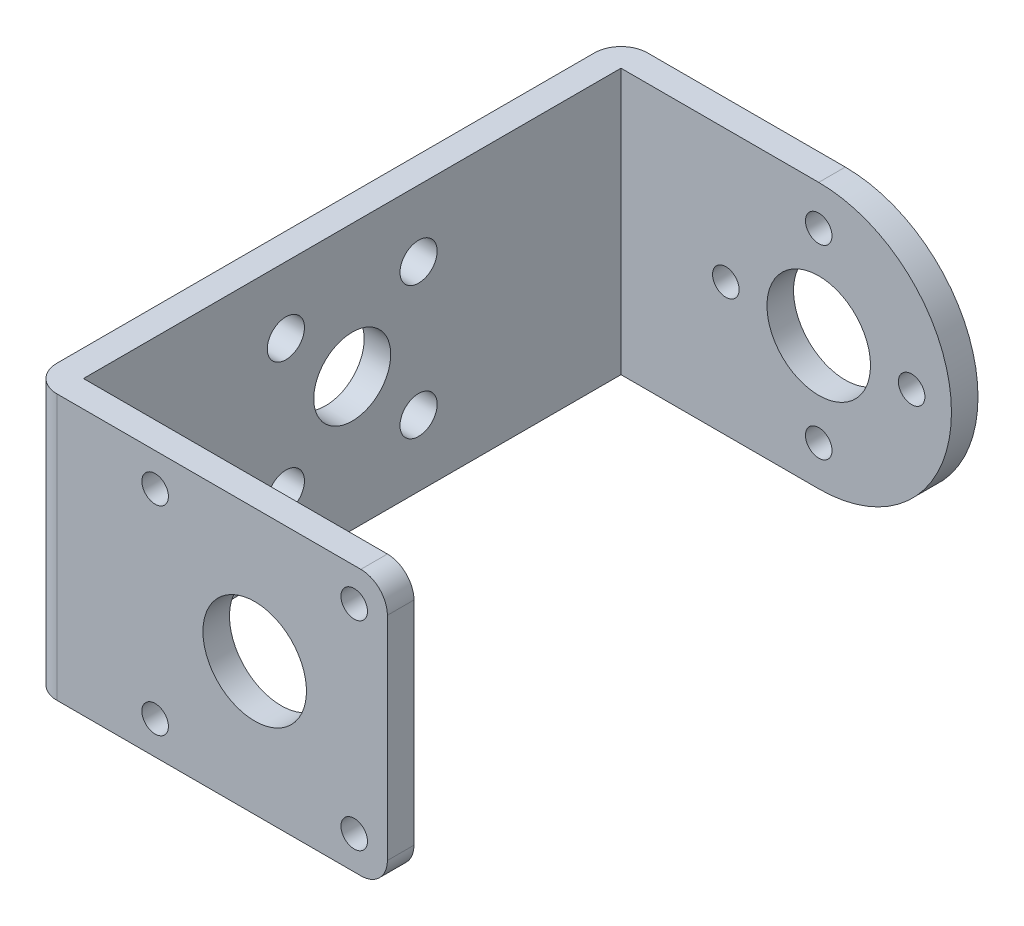
ISO-10303-21;
HEADER;
FILE_DESCRIPTION(('STEP AP214'),'2;1');
FILE_NAME('part.step','',(''),(''),'','','');
FILE_SCHEMA(('AUTOMOTIVE_DESIGN { 1 0 10303 214 1 1 1 1 }'));
ENDSEC;
DATA;
#1=APPLICATION_CONTEXT('core data for automotive mechanical design processes');
#2=APPLICATION_PROTOCOL_DEFINITION('international standard','automotive_design',2000,#1);
#3=PRODUCT_CONTEXT('',#1,'mechanical');
#4=PRODUCT('Part','Part','',(#3));
#5=PRODUCT_RELATED_PRODUCT_CATEGORY('part','',(#4));
#6=PRODUCT_DEFINITION_FORMATION('','',#4);
#7=PRODUCT_DEFINITION_CONTEXT('part definition',#1,'design');
#8=PRODUCT_DEFINITION('design','',#6,#7);
#9=PRODUCT_DEFINITION_SHAPE('','',#8);
#10=(LENGTH_UNIT() NAMED_UNIT(*) SI_UNIT(.MILLI.,.METRE.));
#11=(NAMED_UNIT(*) PLANE_ANGLE_UNIT() SI_UNIT($,.RADIAN.));
#12=(NAMED_UNIT(*) SI_UNIT($,.STERADIAN.) SOLID_ANGLE_UNIT());
#13=UNCERTAINTY_MEASURE_WITH_UNIT(LENGTH_MEASURE(1.E-05),#10,'distance_accuracy_value','');
#14=(GEOMETRIC_REPRESENTATION_CONTEXT(3) GLOBAL_UNCERTAINTY_ASSIGNED_CONTEXT((#13)) GLOBAL_UNIT_ASSIGNED_CONTEXT((#10,
#11,#12)) REPRESENTATION_CONTEXT('',''));
#15=CARTESIAN_POINT('',(0.,0.,0.));
#16=DIRECTION('',(0.,0.,1.));
#17=DIRECTION('',(1.,0.,0.));
#18=AXIS2_PLACEMENT_3D('',#15,#16,#17);
#19=CARTESIAN_POINT('',(-24.9,0.,20.25));
#20=DIRECTION('',(0.,1.,0.));
#21=DIRECTION('',(-0.707106781186548,0.,0.707106781186548));
#22=AXIS2_PLACEMENT_3D('',#19,#20,#21);
#23=CYLINDRICAL_SURFACE('',#22,2.);
#24=CARTESIAN_POINT('',(-24.9,20.,20.25));
#25=DIRECTION('',(0.,-1.,0.));
#26=DIRECTION('',(-0.707106781186548,0.,0.707106781186548));
#27=AXIS2_PLACEMENT_3D('',#24,#25,#26);
#28=CIRCLE('',#27,2.);
#29=CARTESIAN_POINT('',(-24.9,20.,22.25));
#30=VERTEX_POINT('',#29);
#31=CARTESIAN_POINT('',(-26.9,20.,20.25));
#32=VERTEX_POINT('',#31);
#33=EDGE_CURVE('E11',#30,#32,#28,.T.);
#34=ORIENTED_EDGE('',*,*,#33,.T.);
#35=DIRECTION('',(0.,-1.,0.));
#36=VECTOR('',#35,1.);
#37=CARTESIAN_POINT('',(-26.9,0.,20.25));
#38=LINE('',#37,#36);
#39=CARTESIAN_POINT('',(-26.9,0.,20.25));
#40=VERTEX_POINT('',#39);
#41=EDGE_CURVE('E27',#32,#40,#38,.T.);
#42=ORIENTED_EDGE('',*,*,#41,.T.);
#43=CARTESIAN_POINT('',(-24.9,0.,20.25));
#44=DIRECTION('',(0.,1.,0.));
#45=DIRECTION('',(-0.707106781186548,0.,0.707106781186548));
#46=AXIS2_PLACEMENT_3D('',#43,#44,#45);
#47=CIRCLE('',#46,2.);
#48=CARTESIAN_POINT('',(-24.9,0.,22.25));
#49=VERTEX_POINT('',#48);
#50=EDGE_CURVE('E276',#40,#49,#47,.T.);
#51=ORIENTED_EDGE('',*,*,#50,.T.);
#52=DIRECTION('',(0.,1.,0.));
#53=VECTOR('',#52,1.);
#54=CARTESIAN_POINT('',(-24.9,0.,22.25));
#55=LINE('',#54,#53);
#56=EDGE_CURVE('E279',#49,#30,#55,.T.);
#57=ORIENTED_EDGE('',*,*,#56,.T.);
#58=EDGE_LOOP('',(#34,#42,#51,#57));
#59=FACE_BOUND('',#58,.T.);
#60=ADVANCED_FACE('F16',(#59),#23,.T.);
#61=CARTESIAN_POINT('',(-26.9,0.,-22.25));
#62=DIRECTION('',(-1.,0.,0.));
#63=DIRECTION('',(0.,0.,1.));
#64=AXIS2_PLACEMENT_3D('',#61,#62,#63);
#65=PLANE('',#64);
#66=ORIENTED_EDGE('',*,*,#41,.F.);
#67=DIRECTION('',(0.,0.,1.));
#68=VECTOR('',#67,1.);
#69=CARTESIAN_POINT('',(-26.9,20.,22.25));
#70=LINE('',#69,#68);
#71=CARTESIAN_POINT('',(-26.9,20.,-20.25));
#72=VERTEX_POINT('',#71);
#73=EDGE_CURVE('E286',#72,#32,#70,.T.);
#74=ORIENTED_EDGE('',*,*,#73,.F.);
#75=DIRECTION('',(0.,1.,0.));
#76=VECTOR('',#75,1.);
#77=CARTESIAN_POINT('',(-26.9,0.,-20.25));
#78=LINE('',#77,#76);
#79=CARTESIAN_POINT('',(-26.9,0.,-20.25));
#80=VERTEX_POINT('',#79);
#81=EDGE_CURVE('E305',#80,#72,#78,.T.);
#82=ORIENTED_EDGE('',*,*,#81,.F.);
#83=DIRECTION('',(0.,0.,-1.));
#84=VECTOR('',#83,1.);
#85=CARTESIAN_POINT('',(-26.9,0.,22.25));
#86=LINE('',#85,#84);
#87=EDGE_CURVE('E285',#40,#80,#86,.T.);
#88=ORIENTED_EDGE('',*,*,#87,.F.);
#89=EDGE_LOOP('',(#66,#74,#82,#88));
#90=FACE_BOUND('',#89,.T.);
#91=CARTESIAN_POINT('',(-26.9,15.,-5.));
#92=DIRECTION('',(1.,0.,0.));
#93=DIRECTION('',(0.,0.,1.));
#94=AXIS2_PLACEMENT_3D('',#91,#92,#93);
#95=CIRCLE('',#94,1.4);
#96=CARTESIAN_POINT('',(-26.9,15.,-6.4));
#97=VERTEX_POINT('',#96);
#98=EDGE_CURVE('E495',#97,#97,#95,.T.);
#99=ORIENTED_EDGE('',*,*,#98,.T.);
#100=EDGE_LOOP('',(#99));
#101=FACE_BOUND('',#100,.T.);
#102=CARTESIAN_POINT('',(-26.9,5.,-5.));
#103=DIRECTION('',(1.,0.,0.));
#104=DIRECTION('',(0.,0.,1.));
#105=AXIS2_PLACEMENT_3D('',#102,#103,#104);
#106=CIRCLE('',#105,1.4);
#107=CARTESIAN_POINT('',(-26.9,5.,-6.4));
#108=VERTEX_POINT('',#107);
#109=EDGE_CURVE('E266',#108,#108,#106,.T.);
#110=ORIENTED_EDGE('',*,*,#109,.T.);
#111=EDGE_LOOP('',(#110));
#112=FACE_BOUND('',#111,.T.);
#113=CARTESIAN_POINT('',(-26.9,15.,5.));
#114=DIRECTION('',(1.,0.,0.));
#115=DIRECTION('',(0.,0.,1.));
#116=AXIS2_PLACEMENT_3D('',#113,#114,#115);
#117=CIRCLE('',#116,1.4);
#118=CARTESIAN_POINT('',(-26.9,15.,3.6));
#119=VERTEX_POINT('',#118);
#120=EDGE_CURVE('E258',#119,#119,#117,.T.);
#121=ORIENTED_EDGE('',*,*,#120,.T.);
#122=EDGE_LOOP('',(#121));
#123=FACE_BOUND('',#122,.T.);
#124=CARTESIAN_POINT('',(-26.9,10.,0.));
#125=DIRECTION('',(1.,0.,0.));
#126=DIRECTION('',(0.,0.,1.));
#127=AXIS2_PLACEMENT_3D('',#124,#125,#126);
#128=CIRCLE('',#127,2.9);
#129=CARTESIAN_POINT('',(-26.9,10.,-2.9));
#130=VERTEX_POINT('',#129);
#131=EDGE_CURVE('E252',#130,#130,#128,.T.);
#132=ORIENTED_EDGE('',*,*,#131,.T.);
#133=EDGE_LOOP('',(#132));
#134=FACE_BOUND('',#133,.T.);
#135=CARTESIAN_POINT('',(-26.9,5.,5.));
#136=DIRECTION('',(1.,0.,0.));
#137=DIRECTION('',(0.,0.,1.));
#138=AXIS2_PLACEMENT_3D('',#135,#136,#137);
#139=CIRCLE('',#138,1.4);
#140=CARTESIAN_POINT('',(-26.9,5.,3.6));
#141=VERTEX_POINT('',#140);
#142=EDGE_CURVE('E259',#141,#141,#139,.T.);
#143=ORIENTED_EDGE('',*,*,#142,.T.);
#144=EDGE_LOOP('',(#143));
#145=FACE_BOUND('',#144,.T.);
#146=ADVANCED_FACE('F600',(#90,#101,#112,#123,#134,#145),#65,.T.);
#147=CARTESIAN_POINT('',(-13.45,20.,0.));
#148=DIRECTION('',(0.,1.,0.));
#149=DIRECTION('',(0.,0.,1.));
#150=AXIS2_PLACEMENT_3D('',#147,#148,#149);
#151=PLANE('',#150);
#152=ORIENTED_EDGE('',*,*,#33,.F.);
#153=DIRECTION('',(1.,0.,0.));
#154=VECTOR('',#153,1.);
#155=CARTESIAN_POINT('',(0.,20.,22.25));
#156=LINE('',#155,#154);
#157=CARTESIAN_POINT('',(-2.,20.,22.25));
#158=VERTEX_POINT('',#157);
#159=EDGE_CURVE('E270',#30,#158,#156,.T.);
#160=ORIENTED_EDGE('',*,*,#159,.T.);
#161=DIRECTION('',(0.,0.,1.));
#162=VECTOR('',#161,1.);
#163=CARTESIAN_POINT('',(-2.,20.,11.125));
#164=LINE('',#163,#162);
#165=CARTESIAN_POINT('',(-2.,20.,20.25));
#166=VERTEX_POINT('',#165);
#167=EDGE_CURVE('E359',#166,#158,#164,.T.);
#168=ORIENTED_EDGE('',*,*,#167,.F.);
#169=DIRECTION('',(-1.,0.,0.));
#170=VECTOR('',#169,1.);
#171=CARTESIAN_POINT('',(0.,20.,20.25));
#172=LINE('',#171,#170);
#173=CARTESIAN_POINT('',(-24.9,20.,20.25));
#174=VERTEX_POINT('',#173);
#175=EDGE_CURVE('E295',#166,#174,#172,.T.);
#176=ORIENTED_EDGE('',*,*,#175,.T.);
#177=DIRECTION('',(0.,0.,-1.));
#178=VECTOR('',#177,1.);
#179=CARTESIAN_POINT('',(-24.9,20.,20.25));
#180=LINE('',#179,#178);
#181=CARTESIAN_POINT('',(-24.9,20.,-20.25));
#182=VERTEX_POINT('',#181);
#183=EDGE_CURVE('E455',#174,#182,#180,.T.);
#184=ORIENTED_EDGE('',*,*,#183,.T.);
#185=DIRECTION('',(1.,0.,0.));
#186=VECTOR('',#185,1.);
#187=CARTESIAN_POINT('',(-24.9,20.,-20.25));
#188=LINE('',#187,#186);
#189=CARTESIAN_POINT('',(-10.,20.,-20.25));
#190=VERTEX_POINT('',#189);
#191=EDGE_CURVE('E300',#182,#190,#188,.T.);
#192=ORIENTED_EDGE('',*,*,#191,.T.);
#193=DIRECTION('',(0.,0.,-1.));
#194=VECTOR('',#193,1.);
#195=CARTESIAN_POINT('',(-10.,20.,-22.25));
#196=LINE('',#195,#194);
#197=CARTESIAN_POINT('',(-10.,20.,-22.25));
#198=VERTEX_POINT('',#197);
#199=EDGE_CURVE('E296',#190,#198,#196,.T.);
#200=ORIENTED_EDGE('',*,*,#199,.T.);
#201=DIRECTION('',(-1.,0.,0.));
#202=VECTOR('',#201,1.);
#203=CARTESIAN_POINT('',(-26.9,20.,-22.25));
#204=LINE('',#203,#202);
#205=CARTESIAN_POINT('',(-24.9,20.,-22.25));
#206=VERTEX_POINT('',#205);
#207=EDGE_CURVE('E290',#198,#206,#204,.T.);
#208=ORIENTED_EDGE('',*,*,#207,.T.);
#209=CARTESIAN_POINT('',(-24.9,20.,-20.25));
#210=DIRECTION('',(0.,-1.,0.));
#211=DIRECTION('',(-0.707106781186548,0.,-0.707106781186548));
#212=AXIS2_PLACEMENT_3D('',#209,#210,#211);
#213=CIRCLE('',#212,2.);
#214=EDGE_CURVE('E291',#72,#206,#213,.T.);
#215=ORIENTED_EDGE('',*,*,#214,.F.);
#216=ORIENTED_EDGE('',*,*,#73,.T.);
#217=EDGE_LOOP('',(#152,#160,#168,#176,#184,#192,#200,#208,#215,#216));
#218=FACE_BOUND('',#217,.T.);
#219=ADVANCED_FACE('F606',(#218),#151,.T.);
#220=CARTESIAN_POINT('',(-24.9,0.,-20.25));
#221=DIRECTION('',(0.,1.,0.));
#222=DIRECTION('',(-0.707106781186548,0.,-0.707106781186548));
#223=AXIS2_PLACEMENT_3D('',#220,#221,#222);
#224=CYLINDRICAL_SURFACE('',#223,2.);
#225=ORIENTED_EDGE('',*,*,#214,.T.);
#226=DIRECTION('',(0.,-1.,0.));
#227=VECTOR('',#226,1.);
#228=CARTESIAN_POINT('',(-24.9,0.,-22.25));
#229=LINE('',#228,#227);
#230=CARTESIAN_POINT('',(-24.9,0.,-22.25));
#231=VERTEX_POINT('',#230);
#232=EDGE_CURVE('E379',#206,#231,#229,.T.);
#233=ORIENTED_EDGE('',*,*,#232,.T.);
#234=CARTESIAN_POINT('',(-24.9,0.,-20.25));
#235=DIRECTION('',(0.,1.,0.));
#236=DIRECTION('',(-0.707106781186548,0.,-0.707106781186548));
#237=AXIS2_PLACEMENT_3D('',#234,#235,#236);
#238=CIRCLE('',#237,2.);
#239=EDGE_CURVE('E396',#231,#80,#238,.T.);
#240=ORIENTED_EDGE('',*,*,#239,.T.);
#241=ORIENTED_EDGE('',*,*,#81,.T.);
#242=EDGE_LOOP('',(#225,#233,#240,#241));
#243=FACE_BOUND('',#242,.T.);
#244=ADVANCED_FACE('F630',(#243),#224,.T.);
#245=CARTESIAN_POINT('',(-2.,2.,11.125));
#246=DIRECTION('',(0.,0.,1.));
#247=DIRECTION('',(0.707106781186548,-0.707106781186547,0.));
#248=AXIS2_PLACEMENT_3D('',#245,#246,#247);
#249=CYLINDRICAL_SURFACE('',#248,2.);
#250=CARTESIAN_POINT('',(-2.,2.,22.25));
#251=DIRECTION('',(0.,0.,-1.));
#252=DIRECTION('',(0.707106781186548,-0.707106781186547,0.));
#253=AXIS2_PLACEMENT_3D('',#250,#251,#252);
#254=CIRCLE('',#253,2.);
#255=CARTESIAN_POINT('',(0.,2.,22.25));
#256=VERTEX_POINT('',#255);
#257=CARTESIAN_POINT('',(-2.,0.,22.25));
#258=VERTEX_POINT('',#257);
#259=EDGE_CURVE('E301',#256,#258,#254,.T.);
#260=ORIENTED_EDGE('',*,*,#259,.T.);
#261=DIRECTION('',(0.,0.,-1.));
#262=VECTOR('',#261,1.);
#263=CARTESIAN_POINT('',(-2.,0.,11.125));
#264=LINE('',#263,#262);
#265=CARTESIAN_POINT('',(-2.,0.,20.25));
#266=VERTEX_POINT('',#265);
#267=EDGE_CURVE('E306',#258,#266,#264,.T.);
#268=ORIENTED_EDGE('',*,*,#267,.T.);
#269=CARTESIAN_POINT('',(-2.,2.,20.25));
#270=DIRECTION('',(0.,0.,1.));
#271=DIRECTION('',(0.707106781186548,-0.707106781186547,0.));
#272=AXIS2_PLACEMENT_3D('',#269,#270,#271);
#273=CIRCLE('',#272,2.);
#274=CARTESIAN_POINT('',(0.,2.,20.25));
#275=VERTEX_POINT('',#274);
#276=EDGE_CURVE('E448',#266,#275,#273,.T.);
#277=ORIENTED_EDGE('',*,*,#276,.T.);
#278=DIRECTION('',(0.,0.,1.));
#279=VECTOR('',#278,1.);
#280=CARTESIAN_POINT('',(0.,2.,11.125));
#281=LINE('',#280,#279);
#282=EDGE_CURVE('E413',#275,#256,#281,.T.);
#283=ORIENTED_EDGE('',*,*,#282,.T.);
#284=EDGE_LOOP('',(#260,#268,#277,#283));
#285=FACE_BOUND('',#284,.T.);
#286=ADVANCED_FACE('F633',(#285),#249,.T.);
#287=CARTESIAN_POINT('',(0.,0.,22.25));
#288=DIRECTION('',(1.,0.,0.));
#289=DIRECTION('',(0.,-1.,0.));
#290=AXIS2_PLACEMENT_3D('',#287,#288,#289);
#291=PLANE('',#290);
#292=ORIENTED_EDGE('',*,*,#282,.F.);
#293=DIRECTION('',(0.,1.,0.));
#294=VECTOR('',#293,1.);
#295=CARTESIAN_POINT('',(0.,0.,20.25));
#296=LINE('',#295,#294);
#297=CARTESIAN_POINT('',(0.,18.,20.25));
#298=VERTEX_POINT('',#297);
#299=EDGE_CURVE('E409',#275,#298,#296,.T.);
#300=ORIENTED_EDGE('',*,*,#299,.T.);
#301=DIRECTION('',(0.,0.,-1.));
#302=VECTOR('',#301,1.);
#303=CARTESIAN_POINT('',(0.,18.,11.125));
#304=LINE('',#303,#302);
#305=CARTESIAN_POINT('',(0.,18.,22.25));
#306=VERTEX_POINT('',#305);
#307=EDGE_CURVE('E20',#306,#298,#304,.T.);
#308=ORIENTED_EDGE('',*,*,#307,.F.);
#309=DIRECTION('',(0.,1.,0.));
#310=VECTOR('',#309,1.);
#311=CARTESIAN_POINT('',(0.,0.,22.25));
#312=LINE('',#311,#310);
#313=EDGE_CURVE('E487',#256,#306,#312,.T.);
#314=ORIENTED_EDGE('',*,*,#313,.F.);
#315=EDGE_LOOP('',(#292,#300,#308,#314));
#316=FACE_BOUND('',#315,.T.);
#317=ADVANCED_FACE('F575',(#316),#291,.T.);
#318=CARTESIAN_POINT('',(0.,0.,20.25));
#319=DIRECTION('',(0.,0.,-1.));
#320=DIRECTION('',(-1.,0.,0.));
#321=AXIS2_PLACEMENT_3D('',#318,#319,#320);
#322=PLANE('',#321);
#323=ORIENTED_EDGE('',*,*,#276,.F.);
#324=DIRECTION('',(-1.,0.,0.));
#325=VECTOR('',#324,1.);
#326=CARTESIAN_POINT('',(0.,0.,20.25));
#327=LINE('',#326,#325);
#328=CARTESIAN_POINT('',(-24.9,0.,20.25));
#329=VERTEX_POINT('',#328);
#330=EDGE_CURVE('E414',#266,#329,#327,.T.);
#331=ORIENTED_EDGE('',*,*,#330,.T.);
#332=DIRECTION('',(0.,1.,0.));
#333=VECTOR('',#332,1.);
#334=CARTESIAN_POINT('',(-24.9,0.,20.25));
#335=LINE('',#334,#333);
#336=EDGE_CURVE('E364',#329,#174,#335,.T.);
#337=ORIENTED_EDGE('',*,*,#336,.T.);
#338=ORIENTED_EDGE('',*,*,#175,.F.);
#339=CARTESIAN_POINT('',(-2.,18.,20.25));
#340=DIRECTION('',(0.,0.,1.));
#341=DIRECTION('',(0.707106781186548,0.707106781186547,0.));
#342=AXIS2_PLACEMENT_3D('',#339,#340,#341);
#343=CIRCLE('',#342,2.);
#344=EDGE_CURVE('E354',#298,#166,#343,.T.);
#345=ORIENTED_EDGE('',*,*,#344,.F.);
#346=ORIENTED_EDGE('',*,*,#299,.F.);
#347=EDGE_LOOP('',(#323,#331,#337,#338,#345,#346));
#348=FACE_BOUND('',#347,.T.);
#349=CARTESIAN_POINT('',(-2.5,2.5,20.25));
#350=DIRECTION('',(0.,0.,1.));
#351=DIRECTION('',(1.,0.,0.));
#352=AXIS2_PLACEMENT_3D('',#349,#350,#351);
#353=CIRCLE('',#352,1.);
#354=CARTESIAN_POINT('',(-3.5,2.5,20.25));
#355=VERTEX_POINT('',#354);
#356=EDGE_CURVE('E360',#355,#355,#353,.T.);
#357=ORIENTED_EDGE('',*,*,#356,.T.);
#358=EDGE_LOOP('',(#357));
#359=FACE_BOUND('',#358,.T.);
#360=CARTESIAN_POINT('',(-17.5,2.5,20.25));
#361=DIRECTION('',(0.,0.,1.));
#362=DIRECTION('',(1.,0.,0.));
#363=AXIS2_PLACEMENT_3D('',#360,#361,#362);
#364=CIRCLE('',#363,1.);
#365=CARTESIAN_POINT('',(-18.5,2.5,20.25));
#366=VERTEX_POINT('',#365);
#367=EDGE_CURVE('E365',#366,#366,#364,.T.);
#368=ORIENTED_EDGE('',*,*,#367,.T.);
#369=EDGE_LOOP('',(#368));
#370=FACE_BOUND('',#369,.T.);
#371=CARTESIAN_POINT('',(-2.5,17.5,20.25));
#372=DIRECTION('',(0.,0.,1.));
#373=DIRECTION('',(1.,0.,0.));
#374=AXIS2_PLACEMENT_3D('',#371,#372,#373);
#375=CIRCLE('',#374,1.);
#376=CARTESIAN_POINT('',(-3.5,17.5,20.25));
#377=VERTEX_POINT('',#376);
#378=EDGE_CURVE('E376',#377,#377,#375,.T.);
#379=ORIENTED_EDGE('',*,*,#378,.T.);
#380=EDGE_LOOP('',(#379));
#381=FACE_BOUND('',#380,.T.);
#382=CARTESIAN_POINT('',(-10.,10.,20.25));
#383=DIRECTION('',(0.,0.,1.));
#384=DIRECTION('',(1.,0.,0.));
#385=AXIS2_PLACEMENT_3D('',#382,#383,#384);
#386=CIRCLE('',#385,3.9);
#387=CARTESIAN_POINT('',(-13.9,10.,20.25));
#388=VERTEX_POINT('',#387);
#389=EDGE_CURVE('E372',#388,#388,#386,.T.);
#390=ORIENTED_EDGE('',*,*,#389,.T.);
#391=EDGE_LOOP('',(#390));
#392=FACE_BOUND('',#391,.T.);
#393=CARTESIAN_POINT('',(-17.5,17.5,20.25));
#394=DIRECTION('',(0.,0.,1.));
#395=DIRECTION('',(1.,0.,0.));
#396=AXIS2_PLACEMENT_3D('',#393,#394,#395);
#397=CIRCLE('',#396,1.);
#398=CARTESIAN_POINT('',(-18.5,17.5,20.25));
#399=VERTEX_POINT('',#398);
#400=EDGE_CURVE('E358',#399,#399,#397,.T.);
#401=ORIENTED_EDGE('',*,*,#400,.T.);
#402=EDGE_LOOP('',(#401));
#403=FACE_BOUND('',#402,.T.);
#404=ADVANCED_FACE('F571',(#348,#359,#370,#381,#392,#403),#322,.T.);
#405=CARTESIAN_POINT('',(-2.,18.,11.125));
#406=DIRECTION('',(0.,0.,-1.));
#407=DIRECTION('',(0.707106781186548,0.707106781186547,0.));
#408=AXIS2_PLACEMENT_3D('',#405,#406,#407);
#409=CYLINDRICAL_SURFACE('',#408,2.);
#410=ORIENTED_EDGE('',*,*,#344,.T.);
#411=ORIENTED_EDGE('',*,*,#167,.T.);
#412=CARTESIAN_POINT('',(-2.,18.,22.25));
#413=DIRECTION('',(0.,0.,-1.));
#414=DIRECTION('',(0.707106781186548,0.707106781186547,0.));
#415=AXIS2_PLACEMENT_3D('',#412,#413,#414);
#416=CIRCLE('',#415,2.);
#417=EDGE_CURVE('E481',#158,#306,#416,.T.);
#418=ORIENTED_EDGE('',*,*,#417,.T.);
#419=ORIENTED_EDGE('',*,*,#307,.T.);
#420=EDGE_LOOP('',(#410,#411,#418,#419));
#421=FACE_BOUND('',#420,.T.);
#422=ADVANCED_FACE('F574',(#421),#409,.T.);
#423=CARTESIAN_POINT('',(-26.9,15.,-5.));
#424=DIRECTION('',(1.,0.,0.));
#425=DIRECTION('',(0.,0.,1.));
#426=AXIS2_PLACEMENT_3D('',#423,#424,#425);
#427=CYLINDRICAL_SURFACE('',#426,1.4);
#428=ORIENTED_EDGE('',*,*,#98,.F.);
#429=DIRECTION('',(1.,0.,0.));
#430=VECTOR('',#429,1.);
#431=CARTESIAN_POINT('',(-26.9,15.,-6.4));
#432=LINE('',#431,#430);
#433=CARTESIAN_POINT('',(-24.9,15.,-6.4));
#434=VERTEX_POINT('',#433);
#435=EDGE_CURVE('E349',#97,#434,#432,.T.);
#436=ORIENTED_EDGE('',*,*,#435,.T.);
#437=CARTESIAN_POINT('',(-24.9,15.,-5.));
#438=DIRECTION('',(-1.,0.,0.));
#439=DIRECTION('',(0.,0.,1.));
#440=AXIS2_PLACEMENT_3D('',#437,#438,#439);
#441=CIRCLE('',#440,1.4);
#442=EDGE_CURVE('E397',#434,#434,#441,.T.);
#443=ORIENTED_EDGE('',*,*,#442,.F.);
#444=ORIENTED_EDGE('',*,*,#435,.F.);
#445=EDGE_LOOP('',(#428,#436,#443,#444));
#446=FACE_BOUND('',#445,.T.);
#447=ADVANCED_FACE('F610',(#446),#427,.F.);
#448=CARTESIAN_POINT('',(-26.9,5.,-5.));
#449=DIRECTION('',(1.,0.,0.));
#450=DIRECTION('',(0.,0.,1.));
#451=AXIS2_PLACEMENT_3D('',#448,#449,#450);
#452=CYLINDRICAL_SURFACE('',#451,1.4);
#453=ORIENTED_EDGE('',*,*,#109,.F.);
#454=DIRECTION('',(1.,0.,0.));
#455=VECTOR('',#454,1.);
#456=CARTESIAN_POINT('',(-26.9,5.,-6.4));
#457=LINE('',#456,#455);
#458=CARTESIAN_POINT('',(-24.9,5.,-6.4));
#459=VERTEX_POINT('',#458);
#460=EDGE_CURVE('E353',#108,#459,#457,.T.);
#461=ORIENTED_EDGE('',*,*,#460,.T.);
#462=CARTESIAN_POINT('',(-24.9,5.,-5.));
#463=DIRECTION('',(-1.,0.,0.));
#464=DIRECTION('',(0.,0.,1.));
#465=AXIS2_PLACEMENT_3D('',#462,#463,#464);
#466=CIRCLE('',#465,1.4);
#467=EDGE_CURVE('E384',#459,#459,#466,.T.);
#468=ORIENTED_EDGE('',*,*,#467,.F.);
#469=ORIENTED_EDGE('',*,*,#460,.F.);
#470=EDGE_LOOP('',(#453,#461,#468,#469));
#471=FACE_BOUND('',#470,.T.);
#472=ADVANCED_FACE('F658',(#471),#452,.F.);
#473=CARTESIAN_POINT('',(-26.9,15.,5.));
#474=DIRECTION('',(1.,0.,0.));
#475=DIRECTION('',(0.,0.,1.));
#476=AXIS2_PLACEMENT_3D('',#473,#474,#475);
#477=CYLINDRICAL_SURFACE('',#476,1.4);
#478=ORIENTED_EDGE('',*,*,#120,.F.);
#479=DIRECTION('',(1.,0.,0.));
#480=VECTOR('',#479,1.);
#481=CARTESIAN_POINT('',(-26.9,15.,3.6));
#482=LINE('',#481,#480);
#483=CARTESIAN_POINT('',(-24.9,15.,3.6));
#484=VERTEX_POINT('',#483);
#485=EDGE_CURVE('E337',#119,#484,#482,.T.);
#486=ORIENTED_EDGE('',*,*,#485,.T.);
#487=CARTESIAN_POINT('',(-24.9,15.,5.));
#488=DIRECTION('',(-1.,0.,0.));
#489=DIRECTION('',(0.,0.,1.));
#490=AXIS2_PLACEMENT_3D('',#487,#488,#489);
#491=CIRCLE('',#490,1.4);
#492=EDGE_CURVE('E380',#484,#484,#491,.T.);
#493=ORIENTED_EDGE('',*,*,#492,.F.);
#494=ORIENTED_EDGE('',*,*,#485,.F.);
#495=EDGE_LOOP('',(#478,#486,#493,#494));
#496=FACE_BOUND('',#495,.T.);
#497=ADVANCED_FACE('F614',(#496),#477,.F.);
#498=CARTESIAN_POINT('',(-26.9,10.,0.));
#499=DIRECTION('',(1.,0.,0.));
#500=DIRECTION('',(0.,0.,1.));
#501=AXIS2_PLACEMENT_3D('',#498,#499,#500);
#502=CYLINDRICAL_SURFACE('',#501,2.9);
#503=ORIENTED_EDGE('',*,*,#131,.F.);
#504=DIRECTION('',(1.,0.,0.));
#505=VECTOR('',#504,1.);
#506=CARTESIAN_POINT('',(-26.9,10.,-2.9));
#507=LINE('',#506,#505);
#508=CARTESIAN_POINT('',(-24.9,10.,-2.9));
#509=VERTEX_POINT('',#508);
#510=EDGE_CURVE('E254',#130,#509,#507,.T.);
#511=ORIENTED_EDGE('',*,*,#510,.T.);
#512=CARTESIAN_POINT('',(-24.9,10.,0.));
#513=DIRECTION('',(-1.,0.,0.));
#514=DIRECTION('',(0.,0.,1.));
#515=AXIS2_PLACEMENT_3D('',#512,#513,#514);
#516=CIRCLE('',#515,2.9);
#517=EDGE_CURVE('E284',#509,#509,#516,.T.);
#518=ORIENTED_EDGE('',*,*,#517,.F.);
#519=ORIENTED_EDGE('',*,*,#510,.F.);
#520=EDGE_LOOP('',(#503,#511,#518,#519));
#521=FACE_BOUND('',#520,.T.);
#522=ADVANCED_FACE('F253',(#521),#502,.F.);
#523=CARTESIAN_POINT('',(-26.9,5.,5.));
#524=DIRECTION('',(1.,0.,0.));
#525=DIRECTION('',(0.,0.,1.));
#526=AXIS2_PLACEMENT_3D('',#523,#524,#525);
#527=CYLINDRICAL_SURFACE('',#526,1.4);
#528=ORIENTED_EDGE('',*,*,#142,.F.);
#529=DIRECTION('',(1.,0.,0.));
#530=VECTOR('',#529,1.);
#531=CARTESIAN_POINT('',(-26.9,5.,3.6));
#532=LINE('',#531,#530);
#533=CARTESIAN_POINT('',(-24.9,5.,3.6));
#534=VERTEX_POINT('',#533);
#535=EDGE_CURVE('E338',#141,#534,#532,.T.);
#536=ORIENTED_EDGE('',*,*,#535,.T.);
#537=CARTESIAN_POINT('',(-24.9,5.,5.));
#538=DIRECTION('',(-1.,0.,0.));
#539=DIRECTION('',(0.,0.,1.));
#540=AXIS2_PLACEMENT_3D('',#537,#538,#539);
#541=CIRCLE('',#540,1.4);
#542=EDGE_CURVE('E280',#534,#534,#541,.T.);
#543=ORIENTED_EDGE('',*,*,#542,.F.);
#544=ORIENTED_EDGE('',*,*,#535,.F.);
#545=EDGE_LOOP('',(#528,#536,#543,#544));
#546=FACE_BOUND('',#545,.T.);
#547=ADVANCED_FACE('F613',(#546),#527,.F.);
#548=CARTESIAN_POINT('',(-10.,3.,-22.25));
#549=DIRECTION('',(0.,0.,1.));
#550=DIRECTION('',(-1.,0.,0.));
#551=AXIS2_PLACEMENT_3D('',#548,#549,#550);
#552=CYLINDRICAL_SURFACE('',#551,1.);
#553=CARTESIAN_POINT('',(-10.,3.,-22.25));
#554=DIRECTION('',(0.,0.,1.));
#555=DIRECTION('',(-1.,0.,0.));
#556=AXIS2_PLACEMENT_3D('',#553,#554,#555);
#557=CIRCLE('',#556,1.);
#558=CARTESIAN_POINT('',(-9.,3.,-22.25));
#559=VERTEX_POINT('',#558);
#560=EDGE_CURVE('E312',#559,#559,#557,.T.);
#561=ORIENTED_EDGE('',*,*,#560,.F.);
#562=DIRECTION('',(0.,0.,1.));
#563=VECTOR('',#562,1.);
#564=CARTESIAN_POINT('',(-9.,3.,-22.25));
#565=LINE('',#564,#563);
#566=CARTESIAN_POINT('',(-9.,3.,-20.25));
#567=VERTEX_POINT('',#566);
#568=EDGE_CURVE('E344',#559,#567,#565,.T.);
#569=ORIENTED_EDGE('',*,*,#568,.T.);
#570=CARTESIAN_POINT('',(-10.,3.,-20.25));
#571=DIRECTION('',(0.,0.,-1.));
#572=DIRECTION('',(-1.,0.,0.));
#573=AXIS2_PLACEMENT_3D('',#570,#571,#572);
#574=CIRCLE('',#573,1.);
#575=EDGE_CURVE('E385',#567,#567,#574,.T.);
#576=ORIENTED_EDGE('',*,*,#575,.F.);
#577=ORIENTED_EDGE('',*,*,#568,.F.);
#578=EDGE_LOOP('',(#561,#569,#576,#577));
#579=FACE_BOUND('',#578,.T.);
#580=ADVANCED_FACE('F527',(#579),#552,.F.);
#581=CARTESIAN_POINT('',(-3.,10.,-22.25));
#582=DIRECTION('',(0.,0.,1.));
#583=DIRECTION('',(-1.,0.,0.));
#584=AXIS2_PLACEMENT_3D('',#581,#582,#583);
#585=CYLINDRICAL_SURFACE('',#584,1.);
#586=CARTESIAN_POINT('',(-3.,10.,-22.25));
#587=DIRECTION('',(0.,0.,1.));
#588=DIRECTION('',(-1.,0.,0.));
#589=AXIS2_PLACEMENT_3D('',#586,#587,#588);
#590=CIRCLE('',#589,1.);
#591=CARTESIAN_POINT('',(-2.,10.,-22.25));
#592=VERTEX_POINT('',#591);
#593=EDGE_CURVE('E307',#592,#592,#590,.T.);
#594=ORIENTED_EDGE('',*,*,#593,.F.);
#595=DIRECTION('',(0.,0.,1.));
#596=VECTOR('',#595,1.);
#597=CARTESIAN_POINT('',(-2.,10.,-22.25));
#598=LINE('',#597,#596);
#599=CARTESIAN_POINT('',(-2.,10.,-20.25));
#600=VERTEX_POINT('',#599);
#601=EDGE_CURVE('E348',#592,#600,#598,.T.);
#602=ORIENTED_EDGE('',*,*,#601,.T.);
#603=CARTESIAN_POINT('',(-3.,10.,-20.25));
#604=DIRECTION('',(0.,0.,-1.));
#605=DIRECTION('',(-1.,0.,0.));
#606=AXIS2_PLACEMENT_3D('',#603,#604,#605);
#607=CIRCLE('',#606,1.);
#608=EDGE_CURVE('E390',#600,#600,#607,.T.);
#609=ORIENTED_EDGE('',*,*,#608,.F.);
#610=ORIENTED_EDGE('',*,*,#601,.F.);
#611=EDGE_LOOP('',(#594,#602,#609,#610));
#612=FACE_BOUND('',#611,.T.);
#613=ADVANCED_FACE('F615',(#612),#585,.F.);
#614=CARTESIAN_POINT('',(-10.,10.,-22.25));
#615=DIRECTION('',(0.,0.,1.));
#616=DIRECTION('',(1.,0.,0.));
#617=AXIS2_PLACEMENT_3D('',#614,#615,#616);
#618=CYLINDRICAL_SURFACE('',#617,10.);
#619=CARTESIAN_POINT('',(-10.,10.,-22.25));
#620=DIRECTION('',(0.,0.,-1.));
#621=DIRECTION('',(-1.,0.,0.));
#622=AXIS2_PLACEMENT_3D('',#619,#620,#621);
#623=CIRCLE('',#622,10.);
#624=CARTESIAN_POINT('',(-10.,0.,-22.25));
#625=VERTEX_POINT('',#624);
#626=EDGE_CURVE('E329',#198,#625,#623,.T.);
#627=ORIENTED_EDGE('',*,*,#626,.F.);
#628=ORIENTED_EDGE('',*,*,#199,.F.);
#629=CARTESIAN_POINT('',(-10.,10.,-20.25));
#630=DIRECTION('',(0.,0.,1.));
#631=DIRECTION('',(-1.,0.,0.));
#632=AXIS2_PLACEMENT_3D('',#629,#630,#631);
#633=CIRCLE('',#632,10.);
#634=CARTESIAN_POINT('',(-10.,0.,-20.25));
#635=VERTEX_POINT('',#634);
#636=EDGE_CURVE('E469',#635,#190,#633,.T.);
#637=ORIENTED_EDGE('',*,*,#636,.F.);
#638=DIRECTION('',(0.,0.,-1.));
#639=VECTOR('',#638,1.);
#640=CARTESIAN_POINT('',(-10.,0.,-22.25));
#641=LINE('',#640,#639);
#642=EDGE_CURVE('E317',#635,#625,#641,.T.);
#643=ORIENTED_EDGE('',*,*,#642,.T.);
#644=EDGE_LOOP('',(#627,#628,#637,#643));
#645=FACE_BOUND('',#644,.T.);
#646=ADVANCED_FACE('F618',(#645),#618,.T.);
#647=CARTESIAN_POINT('',(-17.,10.,-22.25));
#648=DIRECTION('',(0.,0.,1.));
#649=DIRECTION('',(-1.,0.,0.));
#650=AXIS2_PLACEMENT_3D('',#647,#648,#649);
#651=CYLINDRICAL_SURFACE('',#650,1.);
#652=CARTESIAN_POINT('',(-17.,10.,-22.25));
#653=DIRECTION('',(0.,0.,1.));
#654=DIRECTION('',(-1.,0.,0.));
#655=AXIS2_PLACEMENT_3D('',#652,#653,#654);
#656=CIRCLE('',#655,1.);
#657=CARTESIAN_POINT('',(-16.,10.,-22.25));
#658=VERTEX_POINT('',#657);
#659=EDGE_CURVE('E311',#658,#658,#656,.T.);
#660=ORIENTED_EDGE('',*,*,#659,.F.);
#661=DIRECTION('',(0.,0.,1.));
#662=VECTOR('',#661,1.);
#663=CARTESIAN_POINT('',(-16.,10.,-22.25));
#664=LINE('',#663,#662);
#665=CARTESIAN_POINT('',(-16.,10.,-20.25));
#666=VERTEX_POINT('',#665);
#667=EDGE_CURVE('E313',#658,#666,#664,.T.);
#668=ORIENTED_EDGE('',*,*,#667,.T.);
#669=CARTESIAN_POINT('',(-17.,10.,-20.25));
#670=DIRECTION('',(0.,0.,-1.));
#671=DIRECTION('',(-1.,0.,0.));
#672=AXIS2_PLACEMENT_3D('',#669,#670,#671);
#673=CIRCLE('',#672,1.);
#674=EDGE_CURVE('E323',#666,#666,#673,.T.);
#675=ORIENTED_EDGE('',*,*,#674,.F.);
#676=ORIENTED_EDGE('',*,*,#667,.F.);
#677=EDGE_LOOP('',(#660,#668,#675,#676));
#678=FACE_BOUND('',#677,.T.);
#679=ADVANCED_FACE('F623',(#678),#651,.F.);
#680=CARTESIAN_POINT('',(-10.,10.,-22.25));
#681=DIRECTION('',(0.,0.,1.));
#682=DIRECTION('',(-1.,0.,0.));
#683=AXIS2_PLACEMENT_3D('',#680,#681,#682);
#684=CYLINDRICAL_SURFACE('',#683,3.9);
#685=CARTESIAN_POINT('',(-10.,10.,-22.25));
#686=DIRECTION('',(0.,0.,1.));
#687=DIRECTION('',(-1.,0.,0.));
#688=AXIS2_PLACEMENT_3D('',#685,#686,#687);
#689=CIRCLE('',#688,3.9);
#690=CARTESIAN_POINT('',(-6.1,10.,-22.25));
#691=VERTEX_POINT('',#690);
#692=EDGE_CURVE('E424',#691,#691,#689,.T.);
#693=ORIENTED_EDGE('',*,*,#692,.F.);
#694=DIRECTION('',(0.,0.,1.));
#695=VECTOR('',#694,1.);
#696=CARTESIAN_POINT('',(-6.1,10.,-22.25));
#697=LINE('',#696,#695);
#698=CARTESIAN_POINT('',(-6.1,10.,-20.25));
#699=VERTEX_POINT('',#698);
#700=EDGE_CURVE('E318',#691,#699,#697,.T.);
#701=ORIENTED_EDGE('',*,*,#700,.T.);
#702=CARTESIAN_POINT('',(-10.,10.,-20.25));
#703=DIRECTION('',(0.,0.,-1.));
#704=DIRECTION('',(-1.,0.,0.));
#705=AXIS2_PLACEMENT_3D('',#702,#703,#704);
#706=CIRCLE('',#705,3.9);
#707=EDGE_CURVE('E319',#699,#699,#706,.T.);
#708=ORIENTED_EDGE('',*,*,#707,.F.);
#709=ORIENTED_EDGE('',*,*,#700,.F.);
#710=EDGE_LOOP('',(#693,#701,#708,#709));
#711=FACE_BOUND('',#710,.T.);
#712=ADVANCED_FACE('F622',(#711),#684,.F.);
#713=CARTESIAN_POINT('',(-10.,17.,-22.25));
#714=DIRECTION('',(0.,0.,1.));
#715=DIRECTION('',(-1.,0.,0.));
#716=AXIS2_PLACEMENT_3D('',#713,#714,#715);
#717=CYLINDRICAL_SURFACE('',#716,1.);
#718=CARTESIAN_POINT('',(-10.,17.,-22.25));
#719=DIRECTION('',(0.,0.,1.));
#720=DIRECTION('',(-1.,0.,0.));
#721=AXIS2_PLACEMENT_3D('',#718,#719,#720);
#722=CIRCLE('',#721,1.);
#723=CARTESIAN_POINT('',(-9.,17.,-22.25));
#724=VERTEX_POINT('',#723);
#725=EDGE_CURVE('E428',#724,#724,#722,.T.);
#726=ORIENTED_EDGE('',*,*,#725,.F.);
#727=DIRECTION('',(0.,0.,1.));
#728=VECTOR('',#727,1.);
#729=CARTESIAN_POINT('',(-9.,17.,-22.25));
#730=LINE('',#729,#728);
#731=CARTESIAN_POINT('',(-9.,17.,-20.25));
#732=VERTEX_POINT('',#731);
#733=EDGE_CURVE('E325',#724,#732,#730,.T.);
#734=ORIENTED_EDGE('',*,*,#733,.T.);
#735=CARTESIAN_POINT('',(-10.,17.,-20.25));
#736=DIRECTION('',(0.,0.,-1.));
#737=DIRECTION('',(-1.,0.,0.));
#738=AXIS2_PLACEMENT_3D('',#735,#736,#737);
#739=CIRCLE('',#738,1.);
#740=EDGE_CURVE('E324',#732,#732,#739,.T.);
#741=ORIENTED_EDGE('',*,*,#740,.F.);
#742=ORIENTED_EDGE('',*,*,#733,.F.);
#743=EDGE_LOOP('',(#726,#734,#741,#742));
#744=FACE_BOUND('',#743,.T.);
#745=ADVANCED_FACE('F542',(#744),#717,.F.);
#746=CARTESIAN_POINT('',(0.,0.,-22.25));
#747=DIRECTION('',(0.,0.,-1.));
#748=DIRECTION('',(-1.,0.,0.));
#749=AXIS2_PLACEMENT_3D('',#746,#747,#748);
#750=PLANE('',#749);
#751=ORIENTED_EDGE('',*,*,#232,.F.);
#752=ORIENTED_EDGE('',*,*,#207,.F.);
#753=ORIENTED_EDGE('',*,*,#626,.T.);
#754=DIRECTION('',(1.,0.,0.));
#755=VECTOR('',#754,1.);
#756=CARTESIAN_POINT('',(-26.9,0.,-22.25));
#757=LINE('',#756,#755);
#758=EDGE_CURVE('E330',#231,#625,#757,.T.);
#759=ORIENTED_EDGE('',*,*,#758,.F.);
#760=EDGE_LOOP('',(#751,#752,#753,#759));
#761=FACE_BOUND('',#760,.T.);
#762=ORIENTED_EDGE('',*,*,#725,.T.);
#763=EDGE_LOOP('',(#762));
#764=FACE_BOUND('',#763,.T.);
#765=ORIENTED_EDGE('',*,*,#692,.T.);
#766=EDGE_LOOP('',(#765));
#767=FACE_BOUND('',#766,.T.);
#768=ORIENTED_EDGE('',*,*,#659,.T.);
#769=EDGE_LOOP('',(#768));
#770=FACE_BOUND('',#769,.T.);
#771=ORIENTED_EDGE('',*,*,#593,.T.);
#772=EDGE_LOOP('',(#771));
#773=FACE_BOUND('',#772,.T.);
#774=ORIENTED_EDGE('',*,*,#560,.T.);
#775=EDGE_LOOP('',(#774));
#776=FACE_BOUND('',#775,.T.);
#777=ADVANCED_FACE('F525',(#761,#764,#767,#770,#773,#776),#750,.T.);
#778=CARTESIAN_POINT('',(-2.5,2.5,22.25));
#779=DIRECTION('',(0.,0.,-1.));
#780=DIRECTION('',(1.,0.,0.));
#781=AXIS2_PLACEMENT_3D('',#778,#779,#780);
#782=CYLINDRICAL_SURFACE('',#781,1.);
#783=CARTESIAN_POINT('',(-2.5,2.5,22.25));
#784=DIRECTION('',(0.,0.,-1.));
#785=DIRECTION('',(1.,0.,0.));
#786=AXIS2_PLACEMENT_3D('',#783,#784,#785);
#787=CIRCLE('',#786,1.);
#788=CARTESIAN_POINT('',(-3.5,2.5,22.25));
#789=VERTEX_POINT('',#788);
#790=EDGE_CURVE('E370',#789,#789,#787,.T.);
#791=ORIENTED_EDGE('',*,*,#790,.F.);
#792=DIRECTION('',(0.,0.,-1.));
#793=VECTOR('',#792,1.);
#794=CARTESIAN_POINT('',(-3.5,2.5,22.25));
#795=LINE('',#794,#793);
#796=EDGE_CURVE('E432',#789,#355,#795,.T.);
#797=ORIENTED_EDGE('',*,*,#796,.T.);
#798=ORIENTED_EDGE('',*,*,#356,.F.);
#799=ORIENTED_EDGE('',*,*,#796,.F.);
#800=EDGE_LOOP('',(#791,#797,#798,#799));
#801=FACE_BOUND('',#800,.T.);
#802=ADVANCED_FACE('F642',(#801),#782,.F.);
#803=CARTESIAN_POINT('',(-17.5,2.5,22.25));
#804=DIRECTION('',(0.,0.,-1.));
#805=DIRECTION('',(1.,0.,0.));
#806=AXIS2_PLACEMENT_3D('',#803,#804,#805);
#807=CYLINDRICAL_SURFACE('',#806,1.);
#808=CARTESIAN_POINT('',(-17.5,2.5,22.25));
#809=DIRECTION('',(0.,0.,-1.));
#810=DIRECTION('',(1.,0.,0.));
#811=AXIS2_PLACEMENT_3D('',#808,#809,#810);
#812=CIRCLE('',#811,1.);
#813=CARTESIAN_POINT('',(-18.5,2.5,22.25));
#814=VERTEX_POINT('',#813);
#815=EDGE_CURVE('E366',#814,#814,#812,.T.);
#816=ORIENTED_EDGE('',*,*,#815,.F.);
#817=DIRECTION('',(0.,0.,-1.));
#818=VECTOR('',#817,1.);
#819=CARTESIAN_POINT('',(-18.5,2.5,22.25));
#820=LINE('',#819,#818);
#821=EDGE_CURVE('E436',#814,#366,#820,.T.);
#822=ORIENTED_EDGE('',*,*,#821,.T.);
#823=ORIENTED_EDGE('',*,*,#367,.F.);
#824=ORIENTED_EDGE('',*,*,#821,.F.);
#825=EDGE_LOOP('',(#816,#822,#823,#824));
#826=FACE_BOUND('',#825,.T.);
#827=ADVANCED_FACE('F640',(#826),#807,.F.);
#828=CARTESIAN_POINT('',(-2.5,17.5,22.25));
#829=DIRECTION('',(0.,0.,-1.));
#830=DIRECTION('',(1.,0.,0.));
#831=AXIS2_PLACEMENT_3D('',#828,#829,#830);
#832=CYLINDRICAL_SURFACE('',#831,1.);
#833=CARTESIAN_POINT('',(-2.5,17.5,22.25));
#834=DIRECTION('',(0.,0.,-1.));
#835=DIRECTION('',(1.,0.,0.));
#836=AXIS2_PLACEMENT_3D('',#833,#834,#835);
#837=CIRCLE('',#836,1.);
#838=CARTESIAN_POINT('',(-3.5,17.5,22.25));
#839=VERTEX_POINT('',#838);
#840=EDGE_CURVE('E371',#839,#839,#837,.T.);
#841=ORIENTED_EDGE('',*,*,#840,.F.);
#842=DIRECTION('',(0.,0.,-1.));
#843=VECTOR('',#842,1.);
#844=CARTESIAN_POINT('',(-3.5,17.5,22.25));
#845=LINE('',#844,#843);
#846=EDGE_CURVE('E443',#839,#377,#845,.T.);
#847=ORIENTED_EDGE('',*,*,#846,.T.);
#848=ORIENTED_EDGE('',*,*,#378,.F.);
#849=ORIENTED_EDGE('',*,*,#846,.F.);
#850=EDGE_LOOP('',(#841,#847,#848,#849));
#851=FACE_BOUND('',#850,.T.);
#852=ADVANCED_FACE('F569',(#851),#832,.F.);
#853=CARTESIAN_POINT('',(-10.,10.,22.25));
#854=DIRECTION('',(0.,0.,-1.));
#855=DIRECTION('',(1.,0.,0.));
#856=AXIS2_PLACEMENT_3D('',#853,#854,#855);
#857=CYLINDRICAL_SURFACE('',#856,3.9);
#858=CARTESIAN_POINT('',(-10.,10.,22.25));
#859=DIRECTION('',(0.,0.,-1.));
#860=DIRECTION('',(1.,0.,0.));
#861=AXIS2_PLACEMENT_3D('',#858,#859,#860);
#862=CIRCLE('',#861,3.9);
#863=CARTESIAN_POINT('',(-13.9,10.,22.25));
#864=VERTEX_POINT('',#863);
#865=EDGE_CURVE('E468',#864,#864,#862,.T.);
#866=ORIENTED_EDGE('',*,*,#865,.F.);
#867=DIRECTION('',(0.,0.,-1.));
#868=VECTOR('',#867,1.);
#869=CARTESIAN_POINT('',(-13.9,10.,22.25));
#870=LINE('',#869,#868);
#871=EDGE_CURVE('E444',#864,#388,#870,.T.);
#872=ORIENTED_EDGE('',*,*,#871,.T.);
#873=ORIENTED_EDGE('',*,*,#389,.F.);
#874=ORIENTED_EDGE('',*,*,#871,.F.);
#875=EDGE_LOOP('',(#866,#872,#873,#874));
#876=FACE_BOUND('',#875,.T.);
#877=ADVANCED_FACE('F18',(#876),#857,.F.);
#878=CARTESIAN_POINT('',(-17.5,17.5,22.25));
#879=DIRECTION('',(0.,0.,-1.));
#880=DIRECTION('',(1.,0.,0.));
#881=AXIS2_PLACEMENT_3D('',#878,#879,#880);
#882=CYLINDRICAL_SURFACE('',#881,1.);
#883=CARTESIAN_POINT('',(-17.5,17.5,22.25));
#884=DIRECTION('',(0.,0.,-1.));
#885=DIRECTION('',(1.,0.,0.));
#886=AXIS2_PLACEMENT_3D('',#883,#884,#885);
#887=CIRCLE('',#886,1.);
#888=CARTESIAN_POINT('',(-18.5,17.5,22.25));
#889=VERTEX_POINT('',#888);
#890=EDGE_CURVE('E464',#889,#889,#887,.T.);
#891=ORIENTED_EDGE('',*,*,#890,.F.);
#892=DIRECTION('',(0.,0.,-1.));
#893=VECTOR('',#892,1.);
#894=CARTESIAN_POINT('',(-18.5,17.5,22.25));
#895=LINE('',#894,#893);
#896=EDGE_CURVE('E274',#889,#399,#895,.T.);
#897=ORIENTED_EDGE('',*,*,#896,.T.);
#898=ORIENTED_EDGE('',*,*,#400,.F.);
#899=ORIENTED_EDGE('',*,*,#896,.F.);
#900=EDGE_LOOP('',(#891,#897,#898,#899));
#901=FACE_BOUND('',#900,.T.);
#902=ADVANCED_FACE('F585',(#901),#882,.F.);
#903=CARTESIAN_POINT('',(-26.9,0.,22.25));
#904=DIRECTION('',(0.,0.,1.));
#905=DIRECTION('',(0.,1.,0.));
#906=AXIS2_PLACEMENT_3D('',#903,#904,#905);
#907=PLANE('',#906);
#908=ORIENTED_EDGE('',*,*,#56,.F.);
#909=DIRECTION('',(-1.,0.,0.));
#910=VECTOR('',#909,1.);
#911=CARTESIAN_POINT('',(0.,0.,22.25));
#912=LINE('',#911,#910);
#913=EDGE_CURVE('E334',#258,#49,#912,.T.);
#914=ORIENTED_EDGE('',*,*,#913,.F.);
#915=ORIENTED_EDGE('',*,*,#259,.F.);
#916=ORIENTED_EDGE('',*,*,#313,.T.);
#917=ORIENTED_EDGE('',*,*,#417,.F.);
#918=ORIENTED_EDGE('',*,*,#159,.F.);
#919=EDGE_LOOP('',(#908,#914,#915,#916,#917,#918));
#920=FACE_BOUND('',#919,.T.);
#921=ORIENTED_EDGE('',*,*,#790,.T.);
#922=EDGE_LOOP('',(#921));
#923=FACE_BOUND('',#922,.T.);
#924=ORIENTED_EDGE('',*,*,#815,.T.);
#925=EDGE_LOOP('',(#924));
#926=FACE_BOUND('',#925,.T.);
#927=ORIENTED_EDGE('',*,*,#840,.T.);
#928=EDGE_LOOP('',(#927));
#929=FACE_BOUND('',#928,.T.);
#930=ORIENTED_EDGE('',*,*,#865,.T.);
#931=EDGE_LOOP('',(#930));
#932=FACE_BOUND('',#931,.T.);
#933=ORIENTED_EDGE('',*,*,#890,.T.);
#934=EDGE_LOOP('',(#933));
#935=FACE_BOUND('',#934,.T.);
#936=ADVANCED_FACE('F533',(#920,#923,#926,#929,#932,#935),#907,.T.);
#937=CARTESIAN_POINT('',(-24.9,0.,-20.25));
#938=DIRECTION('',(0.,0.,1.));
#939=DIRECTION('',(0.,1.,0.));
#940=AXIS2_PLACEMENT_3D('',#937,#938,#939);
#941=PLANE('',#940);
#942=ORIENTED_EDGE('',*,*,#636,.T.);
#943=ORIENTED_EDGE('',*,*,#191,.F.);
#944=DIRECTION('',(0.,1.,0.));
#945=VECTOR('',#944,1.);
#946=CARTESIAN_POINT('',(-24.9,0.,-20.25));
#947=LINE('',#946,#945);
#948=CARTESIAN_POINT('',(-24.9,0.,-20.25));
#949=VERTEX_POINT('',#948);
#950=EDGE_CURVE('E343',#949,#182,#947,.T.);
#951=ORIENTED_EDGE('',*,*,#950,.F.);
#952=DIRECTION('',(1.,0.,0.));
#953=VECTOR('',#952,1.);
#954=CARTESIAN_POINT('',(-24.9,0.,-20.25));
#955=LINE('',#954,#953);
#956=EDGE_CURVE('E389',#949,#635,#955,.T.);
#957=ORIENTED_EDGE('',*,*,#956,.T.);
#958=EDGE_LOOP('',(#942,#943,#951,#957));
#959=FACE_BOUND('',#958,.T.);
#960=ORIENTED_EDGE('',*,*,#575,.T.);
#961=EDGE_LOOP('',(#960));
#962=FACE_BOUND('',#961,.T.);
#963=ORIENTED_EDGE('',*,*,#608,.T.);
#964=EDGE_LOOP('',(#963));
#965=FACE_BOUND('',#964,.T.);
#966=ORIENTED_EDGE('',*,*,#674,.T.);
#967=EDGE_LOOP('',(#966));
#968=FACE_BOUND('',#967,.T.);
#969=ORIENTED_EDGE('',*,*,#707,.T.);
#970=EDGE_LOOP('',(#969));
#971=FACE_BOUND('',#970,.T.);
#972=ORIENTED_EDGE('',*,*,#740,.T.);
#973=EDGE_LOOP('',(#972));
#974=FACE_BOUND('',#973,.T.);
#975=ADVANCED_FACE('F529',(#959,#962,#965,#968,#971,#974),#941,.T.);
#976=CARTESIAN_POINT('',(-24.9,0.,20.25));
#977=DIRECTION('',(1.,0.,0.));
#978=DIRECTION('',(0.,-1.,0.));
#979=AXIS2_PLACEMENT_3D('',#976,#977,#978);
#980=PLANE('',#979);
#981=DIRECTION('',(0.,0.,-1.));
#982=VECTOR('',#981,1.);
#983=CARTESIAN_POINT('',(-24.9,0.,20.25));
#984=LINE('',#983,#982);
#985=EDGE_CURVE('E339',#329,#949,#984,.T.);
#986=ORIENTED_EDGE('',*,*,#985,.T.);
#987=ORIENTED_EDGE('',*,*,#950,.T.);
#988=ORIENTED_EDGE('',*,*,#183,.F.);
#989=ORIENTED_EDGE('',*,*,#336,.F.);
#990=EDGE_LOOP('',(#986,#987,#988,#989));
#991=FACE_BOUND('',#990,.T.);
#992=ORIENTED_EDGE('',*,*,#442,.T.);
#993=EDGE_LOOP('',(#992));
#994=FACE_BOUND('',#993,.T.);
#995=ORIENTED_EDGE('',*,*,#467,.T.);
#996=EDGE_LOOP('',(#995));
#997=FACE_BOUND('',#996,.T.);
#998=ORIENTED_EDGE('',*,*,#492,.T.);
#999=EDGE_LOOP('',(#998));
#1000=FACE_BOUND('',#999,.T.);
#1001=ORIENTED_EDGE('',*,*,#517,.T.);
#1002=EDGE_LOOP('',(#1001));
#1003=FACE_BOUND('',#1002,.T.);
#1004=ORIENTED_EDGE('',*,*,#542,.T.);
#1005=EDGE_LOOP('',(#1004));
#1006=FACE_BOUND('',#1005,.T.);
#1007=ADVANCED_FACE('F532',(#991,#994,#997,#1000,#1003,#1006),#980,.T.);
#1008=CARTESIAN_POINT('',(-13.45,0.,0.));
#1009=DIRECTION('',(0.,1.,0.));
#1010=DIRECTION('',(0.,0.,1.));
#1011=AXIS2_PLACEMENT_3D('',#1008,#1009,#1010);
#1012=PLANE('',#1011);
#1013=ORIENTED_EDGE('',*,*,#50,.F.);
#1014=ORIENTED_EDGE('',*,*,#87,.T.);
#1015=ORIENTED_EDGE('',*,*,#239,.F.);
#1016=ORIENTED_EDGE('',*,*,#758,.T.);
#1017=ORIENTED_EDGE('',*,*,#642,.F.);
#1018=ORIENTED_EDGE('',*,*,#956,.F.);
#1019=ORIENTED_EDGE('',*,*,#985,.F.);
#1020=ORIENTED_EDGE('',*,*,#330,.F.);
#1021=ORIENTED_EDGE('',*,*,#267,.F.);
#1022=ORIENTED_EDGE('',*,*,#913,.T.);
#1023=EDGE_LOOP('',(#1013,#1014,#1015,#1016,#1017,#1018,#1019,#1020,#1021,#1022));
#1024=FACE_BOUND('',#1023,.T.);
#1025=ADVANCED_FACE('F645',(#1024),#1012,.F.);
#1026=CLOSED_SHELL('',(#60,#146,#219,#244,#286,#317,#404,#422,#447,#472,#497,#522,#547,#580,
#613,#646,#679,#712,#745,#777,#802,#827,#852,#877,#902,#936,#975,#1007,#1025));
#1027=MANIFOLD_SOLID_BREP('B1',#1026);
#1028=ADVANCED_BREP_SHAPE_REPRESENTATION('',(#18,#1027),#14);
#1029=SHAPE_DEFINITION_REPRESENTATION(#9,#1028);
ENDSEC;
END-ISO-10303-21;
